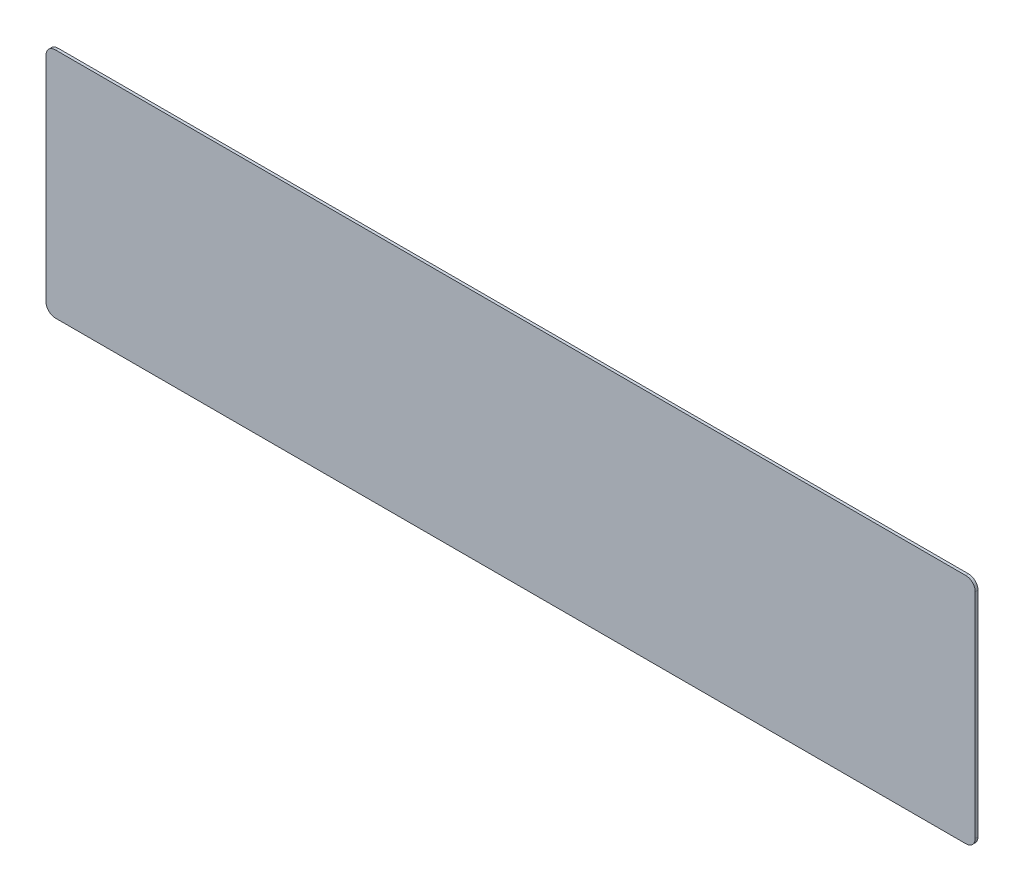
ISO-10303-21;
HEADER;
FILE_DESCRIPTION(('STEP AP214'),'2;1');
FILE_NAME('part.step','',(''),(''),'','','');
FILE_SCHEMA(('AUTOMOTIVE_DESIGN { 1 0 10303 214 1 1 1 1 }'));
ENDSEC;
DATA;
#1=APPLICATION_CONTEXT('core data for automotive mechanical design processes');
#2=APPLICATION_PROTOCOL_DEFINITION('international standard','automotive_design',2000,#1);
#3=PRODUCT_CONTEXT('',#1,'mechanical');
#4=PRODUCT('Part','Part','',(#3));
#5=PRODUCT_RELATED_PRODUCT_CATEGORY('part','',(#4));
#6=PRODUCT_DEFINITION_FORMATION('','',#4);
#7=PRODUCT_DEFINITION_CONTEXT('part definition',#1,'design');
#8=PRODUCT_DEFINITION('design','',#6,#7);
#9=PRODUCT_DEFINITION_SHAPE('','',#8);
#10=(LENGTH_UNIT() NAMED_UNIT(*) SI_UNIT(.MILLI.,.METRE.));
#11=(NAMED_UNIT(*) PLANE_ANGLE_UNIT() SI_UNIT($,.RADIAN.));
#12=(NAMED_UNIT(*) SI_UNIT($,.STERADIAN.) SOLID_ANGLE_UNIT());
#13=UNCERTAINTY_MEASURE_WITH_UNIT(LENGTH_MEASURE(1.E-05),#10,'distance_accuracy_value','');
#14=(GEOMETRIC_REPRESENTATION_CONTEXT(3) GLOBAL_UNCERTAINTY_ASSIGNED_CONTEXT((#13)) GLOBAL_UNIT_ASSIGNED_CONTEXT((#10,
#11,#12)) REPRESENTATION_CONTEXT('',''));
#15=CARTESIAN_POINT('',(0.,0.,0.));
#16=DIRECTION('',(0.,0.,1.));
#17=DIRECTION('',(1.,0.,0.));
#18=AXIS2_PLACEMENT_3D('',#15,#16,#17);
#19=CARTESIAN_POINT('',(694.778858049703,-106.462840619055,3.));
#20=DIRECTION('',(0.,0.,-1.));
#21=DIRECTION('',(-1.,0.,0.));
#22=AXIS2_PLACEMENT_3D('',#19,#20,#21);
#23=CYLINDRICAL_SURFACE('',#22,10.);
#24=CARTESIAN_POINT('',(694.778858049703,-106.462840619055,0.));
#25=DIRECTION('',(0.,0.,1.));
#26=DIRECTION('',(1.,0.,0.));
#27=AXIS2_PLACEMENT_3D('',#24,#25,#26);
#28=CIRCLE('',#27,10.);
#29=CARTESIAN_POINT('',(694.778858049703,-116.462840619055,0.));
#30=VERTEX_POINT('',#29);
#31=CARTESIAN_POINT('',(704.778858049703,-106.462840619055,0.));
#32=VERTEX_POINT('',#31);
#33=EDGE_CURVE('E129',#30,#32,#28,.T.);
#34=ORIENTED_EDGE('',*,*,#33,.T.);
#35=DIRECTION('',(0.,0.,-1.));
#36=VECTOR('',#35,1.);
#37=CARTESIAN_POINT('',(704.778858049703,-106.462840619055,3.));
#38=LINE('',#37,#36);
#39=CARTESIAN_POINT('',(704.778858049703,-106.462840619055,3.));
#40=VERTEX_POINT('',#39);
#41=EDGE_CURVE('E11',#40,#32,#38,.T.);
#42=ORIENTED_EDGE('',*,*,#41,.F.);
#43=CARTESIAN_POINT('',(694.778858049703,-106.462840619055,3.));
#44=DIRECTION('',(0.,0.,1.));
#45=DIRECTION('',(1.,0.,0.));
#46=AXIS2_PLACEMENT_3D('',#43,#44,#45);
#47=CIRCLE('',#46,10.);
#48=CARTESIAN_POINT('',(694.778858049703,-116.462840619055,3.));
#49=VERTEX_POINT('',#48);
#50=EDGE_CURVE('E143',#49,#40,#47,.T.);
#51=ORIENTED_EDGE('',*,*,#50,.F.);
#52=DIRECTION('',(0.,0.,-1.));
#53=VECTOR('',#52,1.);
#54=CARTESIAN_POINT('',(694.778858049703,-116.462840619055,3.));
#55=LINE('',#54,#53);
#56=EDGE_CURVE('E125',#49,#30,#55,.T.);
#57=ORIENTED_EDGE('',*,*,#56,.T.);
#58=EDGE_LOOP('',(#34,#42,#51,#57));
#59=FACE_BOUND('',#58,.T.);
#60=ADVANCED_FACE('F33',(#59),#23,.T.);
#61=CARTESIAN_POINT('',(704.778858049703,-106.462840619055,3.));
#62=DIRECTION('',(-1.,0.,0.));
#63=DIRECTION('',(0.,0.,1.));
#64=AXIS2_PLACEMENT_3D('',#61,#62,#63);
#65=PLANE('',#64);
#66=DIRECTION('',(0.,1.,0.));
#67=VECTOR('',#66,1.);
#68=CARTESIAN_POINT('',(704.778858049703,-106.462840619055,0.));
#69=LINE('',#68,#67);
#70=CARTESIAN_POINT('',(704.778858049703,123.537159380945,0.));
#71=VERTEX_POINT('',#70);
#72=EDGE_CURVE('E132',#32,#71,#69,.T.);
#73=ORIENTED_EDGE('',*,*,#72,.T.);
#74=DIRECTION('',(0.,0.,-1.));
#75=VECTOR('',#74,1.);
#76=CARTESIAN_POINT('',(704.778858049703,123.537159380945,3.));
#77=LINE('',#76,#75);
#78=CARTESIAN_POINT('',(704.778858049703,123.537159380945,3.));
#79=VERTEX_POINT('',#78);
#80=EDGE_CURVE('E41',#79,#71,#77,.T.);
#81=ORIENTED_EDGE('',*,*,#80,.F.);
#82=DIRECTION('',(0.,1.,0.));
#83=VECTOR('',#82,1.);
#84=CARTESIAN_POINT('',(704.778858049703,-106.462840619055,3.));
#85=LINE('',#84,#83);
#86=EDGE_CURVE('E92',#40,#79,#85,.T.);
#87=ORIENTED_EDGE('',*,*,#86,.F.);
#88=ORIENTED_EDGE('',*,*,#41,.T.);
#89=EDGE_LOOP('',(#73,#81,#87,#88));
#90=FACE_BOUND('',#89,.T.);
#91=ADVANCED_FACE('F178',(#90),#65,.F.);
#92=CARTESIAN_POINT('',(694.778858049703,123.537159380945,3.));
#93=DIRECTION('',(0.,0.,-1.));
#94=DIRECTION('',(-1.,0.,0.));
#95=AXIS2_PLACEMENT_3D('',#92,#93,#94);
#96=CYLINDRICAL_SURFACE('',#95,10.);
#97=CARTESIAN_POINT('',(694.778858049703,123.537159380945,0.));
#98=DIRECTION('',(0.,0.,1.));
#99=DIRECTION('',(1.,0.,0.));
#100=AXIS2_PLACEMENT_3D('',#97,#98,#99);
#101=CIRCLE('',#100,10.);
#102=CARTESIAN_POINT('',(694.778858049703,133.537159380945,0.));
#103=VERTEX_POINT('',#102);
#104=EDGE_CURVE('E134',#71,#103,#101,.T.);
#105=ORIENTED_EDGE('',*,*,#104,.T.);
#106=DIRECTION('',(0.,0.,-1.));
#107=VECTOR('',#106,1.);
#108=CARTESIAN_POINT('',(694.778858049703,133.537159380945,3.));
#109=LINE('',#108,#107);
#110=CARTESIAN_POINT('',(694.778858049703,133.537159380945,3.));
#111=VERTEX_POINT('',#110);
#112=EDGE_CURVE('E150',#111,#103,#109,.T.);
#113=ORIENTED_EDGE('',*,*,#112,.F.);
#114=CARTESIAN_POINT('',(694.778858049703,123.537159380945,3.));
#115=DIRECTION('',(0.,0.,1.));
#116=DIRECTION('',(1.,0.,0.));
#117=AXIS2_PLACEMENT_3D('',#114,#115,#116);
#118=CIRCLE('',#117,10.);
#119=EDGE_CURVE('E158',#79,#111,#118,.T.);
#120=ORIENTED_EDGE('',*,*,#119,.F.);
#121=ORIENTED_EDGE('',*,*,#80,.T.);
#122=EDGE_LOOP('',(#105,#113,#120,#121));
#123=FACE_BOUND('',#122,.T.);
#124=ADVANCED_FACE('F156',(#123),#96,.T.);
#125=CARTESIAN_POINT('',(694.778858049703,133.537159380945,3.));
#126=DIRECTION('',(0.,-1.,0.));
#127=DIRECTION('',(1.,0.,0.));
#128=AXIS2_PLACEMENT_3D('',#125,#126,#127);
#129=PLANE('',#128);
#130=DIRECTION('',(-1.,0.,0.));
#131=VECTOR('',#130,1.);
#132=CARTESIAN_POINT('',(694.778858049703,133.537159380945,0.));
#133=LINE('',#132,#131);
#134=CARTESIAN_POINT('',(-285.221141950297,133.537159380945,0.));
#135=VERTEX_POINT('',#134);
#136=EDGE_CURVE('E136',#103,#135,#133,.T.);
#137=ORIENTED_EDGE('',*,*,#136,.T.);
#138=DIRECTION('',(0.,0.,-1.));
#139=VECTOR('',#138,1.);
#140=CARTESIAN_POINT('',(-285.221141950297,133.537159380945,3.));
#141=LINE('',#140,#139);
#142=CARTESIAN_POINT('',(-285.221141950297,133.537159380945,3.));
#143=VERTEX_POINT('',#142);
#144=EDGE_CURVE('E147',#143,#135,#141,.T.);
#145=ORIENTED_EDGE('',*,*,#144,.F.);
#146=DIRECTION('',(-1.,0.,0.));
#147=VECTOR('',#146,1.);
#148=CARTESIAN_POINT('',(694.778858049703,133.537159380945,3.));
#149=LINE('',#148,#147);
#150=EDGE_CURVE('E170',#111,#143,#149,.T.);
#151=ORIENTED_EDGE('',*,*,#150,.F.);
#152=ORIENTED_EDGE('',*,*,#112,.T.);
#153=EDGE_LOOP('',(#137,#145,#151,#152));
#154=FACE_BOUND('',#153,.T.);
#155=ADVANCED_FACE('F166',(#154),#129,.F.);
#156=CARTESIAN_POINT('',(-285.221141950297,123.537159380945,3.));
#157=DIRECTION('',(0.,0.,-1.));
#158=DIRECTION('',(-1.,0.,0.));
#159=AXIS2_PLACEMENT_3D('',#156,#157,#158);
#160=CYLINDRICAL_SURFACE('',#159,10.);
#161=CARTESIAN_POINT('',(-285.221141950297,123.537159380945,0.));
#162=DIRECTION('',(0.,0.,1.));
#163=DIRECTION('',(-1.,0.,0.));
#164=AXIS2_PLACEMENT_3D('',#161,#162,#163);
#165=CIRCLE('',#164,10.);
#166=CARTESIAN_POINT('',(-295.221141950297,123.537159380945,0.));
#167=VERTEX_POINT('',#166);
#168=EDGE_CURVE('E138',#135,#167,#165,.T.);
#169=ORIENTED_EDGE('',*,*,#168,.T.);
#170=DIRECTION('',(0.,0.,-1.));
#171=VECTOR('',#170,1.);
#172=CARTESIAN_POINT('',(-295.221141950297,123.537159380945,3.));
#173=LINE('',#172,#171);
#174=CARTESIAN_POINT('',(-295.221141950297,123.537159380945,3.));
#175=VERTEX_POINT('',#174);
#176=EDGE_CURVE('E120',#175,#167,#173,.T.);
#177=ORIENTED_EDGE('',*,*,#176,.F.);
#178=CARTESIAN_POINT('',(-285.221141950297,123.537159380945,3.));
#179=DIRECTION('',(0.,0.,1.));
#180=DIRECTION('',(-1.,0.,0.));
#181=AXIS2_PLACEMENT_3D('',#178,#179,#180);
#182=CIRCLE('',#181,10.);
#183=EDGE_CURVE('E111',#143,#175,#182,.T.);
#184=ORIENTED_EDGE('',*,*,#183,.F.);
#185=ORIENTED_EDGE('',*,*,#144,.T.);
#186=EDGE_LOOP('',(#169,#177,#184,#185));
#187=FACE_BOUND('',#186,.T.);
#188=ADVANCED_FACE('F169',(#187),#160,.T.);
#189=CARTESIAN_POINT('',(-295.221141950297,-106.462840619055,3.));
#190=DIRECTION('',(1.,0.,0.));
#191=DIRECTION('',(0.,0.,-1.));
#192=AXIS2_PLACEMENT_3D('',#189,#190,#191);
#193=PLANE('',#192);
#194=DIRECTION('',(0.,-1.,0.));
#195=VECTOR('',#194,1.);
#196=CARTESIAN_POINT('',(-295.221141950297,-106.462840619055,0.));
#197=LINE('',#196,#195);
#198=CARTESIAN_POINT('',(-295.221141950297,-106.462840619055,0.));
#199=VERTEX_POINT('',#198);
#200=EDGE_CURVE('E119',#167,#199,#197,.T.);
#201=ORIENTED_EDGE('',*,*,#200,.T.);
#202=DIRECTION('',(0.,0.,-1.));
#203=VECTOR('',#202,1.);
#204=CARTESIAN_POINT('',(-295.221141950297,-106.462840619055,3.));
#205=LINE('',#204,#203);
#206=CARTESIAN_POINT('',(-295.221141950297,-106.462840619055,3.));
#207=VERTEX_POINT('',#206);
#208=EDGE_CURVE('E116',#207,#199,#205,.T.);
#209=ORIENTED_EDGE('',*,*,#208,.F.);
#210=DIRECTION('',(0.,-1.,0.));
#211=VECTOR('',#210,1.);
#212=CARTESIAN_POINT('',(-295.221141950297,-106.462840619055,3.));
#213=LINE('',#212,#211);
#214=EDGE_CURVE('E105',#175,#207,#213,.T.);
#215=ORIENTED_EDGE('',*,*,#214,.F.);
#216=ORIENTED_EDGE('',*,*,#176,.T.);
#217=EDGE_LOOP('',(#201,#209,#215,#216));
#218=FACE_BOUND('',#217,.T.);
#219=ADVANCED_FACE('F117',(#218),#193,.F.);
#220=CARTESIAN_POINT('',(-285.221141950297,-106.462840619055,3.));
#221=DIRECTION('',(0.,0.,-1.));
#222=DIRECTION('',(-1.,0.,0.));
#223=AXIS2_PLACEMENT_3D('',#220,#221,#222);
#224=CYLINDRICAL_SURFACE('',#223,10.);
#225=CARTESIAN_POINT('',(-285.221141950297,-106.462840619055,0.));
#226=DIRECTION('',(0.,0.,1.));
#227=DIRECTION('',(-1.,0.,0.));
#228=AXIS2_PLACEMENT_3D('',#225,#226,#227);
#229=CIRCLE('',#228,10.);
#230=CARTESIAN_POINT('',(-285.221141950297,-116.462840619055,0.));
#231=VERTEX_POINT('',#230);
#232=EDGE_CURVE('E78',#199,#231,#229,.T.);
#233=ORIENTED_EDGE('',*,*,#232,.T.);
#234=DIRECTION('',(0.,0.,-1.));
#235=VECTOR('',#234,1.);
#236=CARTESIAN_POINT('',(-285.221141950297,-116.462840619055,3.));
#237=LINE('',#236,#235);
#238=CARTESIAN_POINT('',(-285.221141950297,-116.462840619055,3.));
#239=VERTEX_POINT('',#238);
#240=EDGE_CURVE('E121',#239,#231,#237,.T.);
#241=ORIENTED_EDGE('',*,*,#240,.F.);
#242=CARTESIAN_POINT('',(-285.221141950297,-106.462840619055,3.));
#243=DIRECTION('',(0.,0.,1.));
#244=DIRECTION('',(-1.,0.,0.));
#245=AXIS2_PLACEMENT_3D('',#242,#243,#244);
#246=CIRCLE('',#245,10.);
#247=EDGE_CURVE('E109',#207,#239,#246,.T.);
#248=ORIENTED_EDGE('',*,*,#247,.F.);
#249=ORIENTED_EDGE('',*,*,#208,.T.);
#250=EDGE_LOOP('',(#233,#241,#248,#249));
#251=FACE_BOUND('',#250,.T.);
#252=ADVANCED_FACE('F123',(#251),#224,.T.);
#253=CARTESIAN_POINT('',(694.778858049703,-116.462840619055,3.));
#254=DIRECTION('',(0.,1.,0.));
#255=DIRECTION('',(-1.,0.,0.));
#256=AXIS2_PLACEMENT_3D('',#253,#254,#255);
#257=PLANE('',#256);
#258=DIRECTION('',(1.,0.,0.));
#259=VECTOR('',#258,1.);
#260=CARTESIAN_POINT('',(694.778858049703,-116.462840619055,0.));
#261=LINE('',#260,#259);
#262=EDGE_CURVE('E84',#231,#30,#261,.T.);
#263=ORIENTED_EDGE('',*,*,#262,.T.);
#264=ORIENTED_EDGE('',*,*,#56,.F.);
#265=DIRECTION('',(1.,0.,0.));
#266=VECTOR('',#265,1.);
#267=CARTESIAN_POINT('',(694.778858049703,-116.462840619055,3.));
#268=LINE('',#267,#266);
#269=EDGE_CURVE('E49',#239,#49,#268,.T.);
#270=ORIENTED_EDGE('',*,*,#269,.F.);
#271=ORIENTED_EDGE('',*,*,#240,.T.);
#272=EDGE_LOOP('',(#263,#264,#270,#271));
#273=FACE_BOUND('',#272,.T.);
#274=ADVANCED_FACE('F194',(#273),#257,.F.);
#275=CARTESIAN_POINT('',(694.778858049703,-106.462840619055,3.));
#276=DIRECTION('',(0.,0.,1.));
#277=DIRECTION('',(1.,0.,0.));
#278=AXIS2_PLACEMENT_3D('',#275,#276,#277);
#279=PLANE('',#278);
#280=ORIENTED_EDGE('',*,*,#50,.T.);
#281=ORIENTED_EDGE('',*,*,#86,.T.);
#282=ORIENTED_EDGE('',*,*,#119,.T.);
#283=ORIENTED_EDGE('',*,*,#150,.T.);
#284=ORIENTED_EDGE('',*,*,#183,.T.);
#285=ORIENTED_EDGE('',*,*,#214,.T.);
#286=ORIENTED_EDGE('',*,*,#247,.T.);
#287=ORIENTED_EDGE('',*,*,#269,.T.);
#288=EDGE_LOOP('',(#280,#281,#282,#283,#284,#285,#286,#287));
#289=FACE_BOUND('',#288,.T.);
#290=ADVANCED_FACE('F107',(#289),#279,.T.);
#291=CARTESIAN_POINT('',(694.778858049703,-106.462840619055,0.));
#292=DIRECTION('',(0.,0.,1.));
#293=DIRECTION('',(1.,0.,0.));
#294=AXIS2_PLACEMENT_3D('',#291,#292,#293);
#295=PLANE('',#294);
#296=ORIENTED_EDGE('',*,*,#33,.F.);
#297=ORIENTED_EDGE('',*,*,#262,.F.);
#298=ORIENTED_EDGE('',*,*,#232,.F.);
#299=ORIENTED_EDGE('',*,*,#200,.F.);
#300=ORIENTED_EDGE('',*,*,#168,.F.);
#301=ORIENTED_EDGE('',*,*,#136,.F.);
#302=ORIENTED_EDGE('',*,*,#104,.F.);
#303=ORIENTED_EDGE('',*,*,#72,.F.);
#304=EDGE_LOOP('',(#296,#297,#298,#299,#300,#301,#302,#303));
#305=FACE_BOUND('',#304,.T.);
#306=ADVANCED_FACE('F162',(#305),#295,.F.);
#307=CLOSED_SHELL('',(#60,#91,#124,#155,#188,#219,#252,#274,#290,#306));
#308=MANIFOLD_SOLID_BREP('B2',#307);
#309=ADVANCED_BREP_SHAPE_REPRESENTATION('',(#18,#308),#14);
#310=SHAPE_DEFINITION_REPRESENTATION(#9,#309);
ENDSEC;
END-ISO-10303-21;
